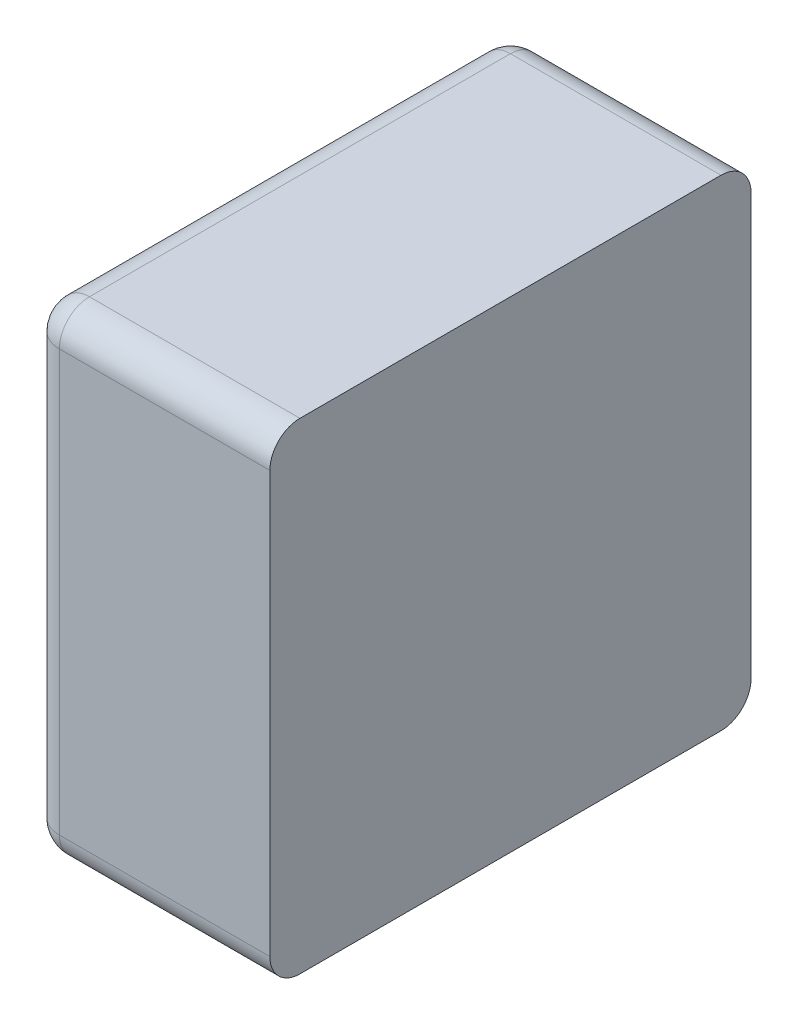
ISO-10303-21;
HEADER;
FILE_DESCRIPTION(('STEP AP214'),'2;1');
FILE_NAME('part.step','',(''),(''),'','','');
FILE_SCHEMA(('AUTOMOTIVE_DESIGN { 1 0 10303 214 1 1 1 1 }'));
ENDSEC;
DATA;
#1=APPLICATION_CONTEXT('core data for automotive mechanical design processes');
#2=APPLICATION_PROTOCOL_DEFINITION('international standard','automotive_design',2000,#1);
#3=PRODUCT_CONTEXT('',#1,'mechanical');
#4=PRODUCT('Part','Part','',(#3));
#5=PRODUCT_RELATED_PRODUCT_CATEGORY('part','',(#4));
#6=PRODUCT_DEFINITION_FORMATION('','',#4);
#7=PRODUCT_DEFINITION_CONTEXT('part definition',#1,'design');
#8=PRODUCT_DEFINITION('design','',#6,#7);
#9=PRODUCT_DEFINITION_SHAPE('','',#8);
#10=(LENGTH_UNIT() NAMED_UNIT(*) SI_UNIT(.MILLI.,.METRE.));
#11=(NAMED_UNIT(*) PLANE_ANGLE_UNIT() SI_UNIT($,.RADIAN.));
#12=(NAMED_UNIT(*) SI_UNIT($,.STERADIAN.) SOLID_ANGLE_UNIT());
#13=UNCERTAINTY_MEASURE_WITH_UNIT(LENGTH_MEASURE(1.E-05),#10,'distance_accuracy_value','');
#14=(GEOMETRIC_REPRESENTATION_CONTEXT(3) GLOBAL_UNCERTAINTY_ASSIGNED_CONTEXT((#13)) GLOBAL_UNIT_ASSIGNED_CONTEXT((#10,
#11,#12)) REPRESENTATION_CONTEXT('',''));
#15=CARTESIAN_POINT('',(0.,0.,0.));
#16=DIRECTION('',(0.,0.,1.));
#17=DIRECTION('',(1.,0.,0.));
#18=AXIS2_PLACEMENT_3D('',#15,#16,#17);
#19=CARTESIAN_POINT('',(0.,0.,0.));
#20=DIRECTION('',(1.,0.,0.));
#21=DIRECTION('',(0.,1.,0.));
#22=AXIS2_PLACEMENT_3D('',#19,#20,#21);
#23=PLANE('',#22);
#24=DIRECTION('',(0.,1.,0.));
#25=VECTOR('',#24,1.);
#26=CARTESIAN_POINT('',(0.,0.,0.75));
#27=LINE('',#26,#25);
#28=CARTESIAN_POINT('',(0.,0.05,0.75));
#29=VERTEX_POINT('',#28);
#30=CARTESIAN_POINT('',(0.,0.75,0.75));
#31=VERTEX_POINT('',#30);
#32=EDGE_CURVE('E11',#29,#31,#27,.T.);
#33=ORIENTED_EDGE('',*,*,#32,.T.);
#34=DIRECTION('',(0.,0.,1.));
#35=VECTOR('',#34,1.);
#36=CARTESIAN_POINT('',(0.,0.75,0.));
#37=LINE('',#36,#35);
#38=CARTESIAN_POINT('',(0.,0.75,0.05));
#39=VERTEX_POINT('',#38);
#40=EDGE_CURVE('E127',#39,#31,#37,.T.);
#41=ORIENTED_EDGE('',*,*,#40,.F.);
#42=DIRECTION('',(0.,1.,0.));
#43=VECTOR('',#42,1.);
#44=CARTESIAN_POINT('',(0.,0.,0.05));
#45=LINE('',#44,#43);
#46=CARTESIAN_POINT('',(0.,0.05,0.05));
#47=VERTEX_POINT('',#46);
#48=EDGE_CURVE('E135',#47,#39,#45,.T.);
#49=ORIENTED_EDGE('',*,*,#48,.F.);
#50=DIRECTION('',(0.,0.,1.));
#51=VECTOR('',#50,1.);
#52=CARTESIAN_POINT('',(0.,0.05,0.));
#53=LINE('',#52,#51);
#54=EDGE_CURVE('E28',#47,#29,#53,.T.);
#55=ORIENTED_EDGE('',*,*,#54,.T.);
#56=EDGE_LOOP('',(#33,#41,#49,#55));
#57=FACE_BOUND('',#56,.T.);
#58=ADVANCED_FACE('F17',(#57),#23,.F.);
#59=CARTESIAN_POINT('',(0.05,0.05,0.));
#60=DIRECTION('',(0.,0.,1.));
#61=DIRECTION('',(-1.,0.,0.));
#62=AXIS2_PLACEMENT_3D('',#59,#60,#61);
#63=CYLINDRICAL_SURFACE('',#62,0.05);
#64=ORIENTED_EDGE('',*,*,#54,.F.);
#65=CARTESIAN_POINT('',(0.05,0.05,0.05));
#66=DIRECTION('',(0.,0.,1.));
#67=DIRECTION('',(-1.,0.,0.));
#68=AXIS2_PLACEMENT_3D('',#65,#66,#67);
#69=CIRCLE('',#68,0.05);
#70=CARTESIAN_POINT('',(0.05,0.,0.05));
#71=VERTEX_POINT('',#70);
#72=EDGE_CURVE('E132',#47,#71,#69,.T.);
#73=ORIENTED_EDGE('',*,*,#72,.T.);
#74=DIRECTION('',(0.,0.,1.));
#75=VECTOR('',#74,1.);
#76=CARTESIAN_POINT('',(0.05,0.,0.));
#77=LINE('',#76,#75);
#78=CARTESIAN_POINT('',(0.05,0.,0.75));
#79=VERTEX_POINT('',#78);
#80=EDGE_CURVE('E191',#71,#79,#77,.T.);
#81=ORIENTED_EDGE('',*,*,#80,.T.);
#82=CARTESIAN_POINT('',(0.05,0.05,0.75));
#83=DIRECTION('',(0.,0.,1.));
#84=DIRECTION('',(-1.,0.,0.));
#85=AXIS2_PLACEMENT_3D('',#82,#83,#84);
#86=CIRCLE('',#85,0.05);
#87=EDGE_CURVE('E128',#29,#79,#86,.T.);
#88=ORIENTED_EDGE('',*,*,#87,.F.);
#89=EDGE_LOOP('',(#64,#73,#81,#88));
#90=FACE_BOUND('',#89,.T.);
#91=ADVANCED_FACE('F261',(#90),#63,.T.);
#92=CARTESIAN_POINT('',(0.05,0.,0.05));
#93=DIRECTION('',(0.,1.,0.));
#94=DIRECTION('',(-1.,0.,0.));
#95=AXIS2_PLACEMENT_3D('',#92,#93,#94);
#96=CYLINDRICAL_SURFACE('',#95,0.05);
#97=ORIENTED_EDGE('',*,*,#48,.T.);
#98=CARTESIAN_POINT('',(0.05,0.75,0.05));
#99=DIRECTION('',(0.,1.,0.));
#100=DIRECTION('',(-1.,0.,0.));
#101=AXIS2_PLACEMENT_3D('',#98,#99,#100);
#102=CIRCLE('',#101,0.05);
#103=CARTESIAN_POINT('',(0.05,0.75,0.));
#104=VERTEX_POINT('',#103);
#105=EDGE_CURVE('E103',#104,#39,#102,.T.);
#106=ORIENTED_EDGE('',*,*,#105,.F.);
#107=DIRECTION('',(0.,1.,0.));
#108=VECTOR('',#107,1.);
#109=CARTESIAN_POINT('',(0.05,0.,0.));
#110=LINE('',#109,#108);
#111=CARTESIAN_POINT('',(0.05,0.05,0.));
#112=VERTEX_POINT('',#111);
#113=EDGE_CURVE('E97',#112,#104,#110,.T.);
#114=ORIENTED_EDGE('',*,*,#113,.F.);
#115=CARTESIAN_POINT('',(0.05,0.05,0.05));
#116=DIRECTION('',(0.,1.,0.));
#117=DIRECTION('',(-1.,0.,0.));
#118=AXIS2_PLACEMENT_3D('',#115,#116,#117);
#119=CIRCLE('',#118,0.05);
#120=EDGE_CURVE('E102',#112,#47,#119,.T.);
#121=ORIENTED_EDGE('',*,*,#120,.T.);
#122=EDGE_LOOP('',(#97,#106,#114,#121));
#123=FACE_BOUND('',#122,.T.);
#124=ADVANCED_FACE('F100',(#123),#96,.T.);
#125=CARTESIAN_POINT('',(0.05,0.,0.75));
#126=DIRECTION('',(0.,1.,0.));
#127=DIRECTION('',(-1.,0.,0.));
#128=AXIS2_PLACEMENT_3D('',#125,#126,#127);
#129=CYLINDRICAL_SURFACE('',#128,0.05);
#130=CARTESIAN_POINT('',(0.05,0.05,0.75));
#131=DIRECTION('',(0.,-1.,0.));
#132=DIRECTION('',(-1.,0.,0.));
#133=AXIS2_PLACEMENT_3D('',#130,#131,#132);
#134=CIRCLE('',#133,0.05);
#135=CARTESIAN_POINT('',(0.05,0.05,0.8));
#136=VERTEX_POINT('',#135);
#137=EDGE_CURVE('E195',#136,#29,#134,.T.);
#138=ORIENTED_EDGE('',*,*,#137,.F.);
#139=DIRECTION('',(0.,1.,0.));
#140=VECTOR('',#139,1.);
#141=CARTESIAN_POINT('',(0.05,0.,0.8));
#142=LINE('',#141,#140);
#143=CARTESIAN_POINT('',(0.05,0.75,0.8));
#144=VERTEX_POINT('',#143);
#145=EDGE_CURVE('E136',#136,#144,#142,.T.);
#146=ORIENTED_EDGE('',*,*,#145,.T.);
#147=CARTESIAN_POINT('',(0.05,0.75,0.75));
#148=DIRECTION('',(0.,1.,0.));
#149=DIRECTION('',(-1.,0.,0.));
#150=AXIS2_PLACEMENT_3D('',#147,#148,#149);
#151=CIRCLE('',#150,0.05);
#152=EDGE_CURVE('E42',#31,#144,#151,.T.);
#153=ORIENTED_EDGE('',*,*,#152,.F.);
#154=ORIENTED_EDGE('',*,*,#32,.F.);
#155=EDGE_LOOP('',(#138,#146,#153,#154));
#156=FACE_BOUND('',#155,.T.);
#157=ADVANCED_FACE('F345',(#156),#129,.T.);
#158=CARTESIAN_POINT('',(0.05,0.75,0.));
#159=DIRECTION('',(0.,0.,1.));
#160=DIRECTION('',(-1.,0.,0.));
#161=AXIS2_PLACEMENT_3D('',#158,#159,#160);
#162=CYLINDRICAL_SURFACE('',#161,0.05);
#163=CARTESIAN_POINT('',(0.05,0.75,0.75));
#164=DIRECTION('',(0.,0.,1.));
#165=DIRECTION('',(-1.,0.,0.));
#166=AXIS2_PLACEMENT_3D('',#163,#164,#165);
#167=CIRCLE('',#166,0.05);
#168=CARTESIAN_POINT('',(0.05,0.8,0.75));
#169=VERTEX_POINT('',#168);
#170=EDGE_CURVE('E157',#169,#31,#167,.T.);
#171=ORIENTED_EDGE('',*,*,#170,.F.);
#172=DIRECTION('',(0.,0.,1.));
#173=VECTOR('',#172,1.);
#174=CARTESIAN_POINT('',(0.05,0.8,0.));
#175=LINE('',#174,#173);
#176=CARTESIAN_POINT('',(0.05,0.8,0.05));
#177=VERTEX_POINT('',#176);
#178=EDGE_CURVE('E150',#177,#169,#175,.T.);
#179=ORIENTED_EDGE('',*,*,#178,.F.);
#180=CARTESIAN_POINT('',(0.05,0.75,0.05));
#181=DIRECTION('',(0.,0.,-1.));
#182=DIRECTION('',(-1.,0.,0.));
#183=AXIS2_PLACEMENT_3D('',#180,#181,#182);
#184=CIRCLE('',#183,0.05);
#185=EDGE_CURVE('E110',#39,#177,#184,.T.);
#186=ORIENTED_EDGE('',*,*,#185,.F.);
#187=ORIENTED_EDGE('',*,*,#40,.T.);
#188=EDGE_LOOP('',(#171,#179,#186,#187));
#189=FACE_BOUND('',#188,.T.);
#190=ADVANCED_FACE('F291',(#189),#162,.T.);
#191=CARTESIAN_POINT('',(0.05,0.05,0.05));
#192=DIRECTION('',(0.,0.,1.));
#193=DIRECTION('',(-1.,0.,0.));
#194=AXIS2_PLACEMENT_3D('',#191,#192,#193);
#195=SPHERICAL_SURFACE('',#194,0.05);
#196=ORIENTED_EDGE('',*,*,#120,.F.);
#197=CARTESIAN_POINT('',(0.05,0.05,0.05));
#198=DIRECTION('',(-1.,0.,0.));
#199=DIRECTION('',(0.,-1.,0.));
#200=AXIS2_PLACEMENT_3D('',#197,#198,#199);
#201=CIRCLE('',#200,0.05);
#202=EDGE_CURVE('E116',#112,#71,#201,.T.);
#203=ORIENTED_EDGE('',*,*,#202,.T.);
#204=ORIENTED_EDGE('',*,*,#72,.F.);
#205=EDGE_LOOP('',(#196,#203,#204));
#206=FACE_BOUND('',#205,.T.);
#207=ADVANCED_FACE('F130',(#206),#195,.T.);
#208=CARTESIAN_POINT('',(0.05,0.05,0.75));
#209=DIRECTION('',(0.,0.,-1.));
#210=DIRECTION('',(-1.,0.,0.));
#211=AXIS2_PLACEMENT_3D('',#208,#209,#210);
#212=SPHERICAL_SURFACE('',#211,0.05);
#213=ORIENTED_EDGE('',*,*,#87,.T.);
#214=CARTESIAN_POINT('',(0.05,0.05,0.75));
#215=DIRECTION('',(1.,0.,0.));
#216=DIRECTION('',(0.,-1.,0.));
#217=AXIS2_PLACEMENT_3D('',#214,#215,#216);
#218=CIRCLE('',#217,0.05);
#219=EDGE_CURVE('E152',#136,#79,#218,.T.);
#220=ORIENTED_EDGE('',*,*,#219,.F.);
#221=ORIENTED_EDGE('',*,*,#137,.T.);
#222=EDGE_LOOP('',(#213,#220,#221));
#223=FACE_BOUND('',#222,.T.);
#224=ADVANCED_FACE('F254',(#223),#212,.T.);
#225=CARTESIAN_POINT('',(0.,0.,0.));
#226=DIRECTION('',(0.,1.,0.));
#227=DIRECTION('',(1.,0.,0.));
#228=AXIS2_PLACEMENT_3D('',#225,#226,#227);
#229=PLANE('',#228);
#230=DIRECTION('',(0.,0.,1.));
#231=VECTOR('',#230,1.);
#232=CARTESIAN_POINT('',(0.4,0.,0.));
#233=LINE('',#232,#231);
#234=CARTESIAN_POINT('',(0.4,0.,0.05));
#235=VERTEX_POINT('',#234);
#236=CARTESIAN_POINT('',(0.4,0.,0.75));
#237=VERTEX_POINT('',#236);
#238=EDGE_CURVE('E199',#235,#237,#233,.T.);
#239=ORIENTED_EDGE('',*,*,#238,.T.);
#240=DIRECTION('',(1.,0.,0.));
#241=VECTOR('',#240,1.);
#242=CARTESIAN_POINT('',(0.,0.,0.75));
#243=LINE('',#242,#241);
#244=EDGE_CURVE('E143',#79,#237,#243,.T.);
#245=ORIENTED_EDGE('',*,*,#244,.F.);
#246=ORIENTED_EDGE('',*,*,#80,.F.);
#247=DIRECTION('',(1.,0.,0.));
#248=VECTOR('',#247,1.);
#249=CARTESIAN_POINT('',(0.,0.,0.05));
#250=LINE('',#249,#248);
#251=EDGE_CURVE('E122',#71,#235,#250,.T.);
#252=ORIENTED_EDGE('',*,*,#251,.T.);
#253=EDGE_LOOP('',(#239,#245,#246,#252));
#254=FACE_BOUND('',#253,.T.);
#255=ADVANCED_FACE('F263',(#254),#229,.F.);
#256=CARTESIAN_POINT('',(0.,0.,0.));
#257=DIRECTION('',(0.,0.,1.));
#258=DIRECTION('',(1.,0.,0.));
#259=AXIS2_PLACEMENT_3D('',#256,#257,#258);
#260=PLANE('',#259);
#261=DIRECTION('',(1.,0.,0.));
#262=VECTOR('',#261,1.);
#263=CARTESIAN_POINT('',(0.,0.75,0.));
#264=LINE('',#263,#262);
#265=CARTESIAN_POINT('',(0.4,0.75,0.));
#266=VERTEX_POINT('',#265);
#267=EDGE_CURVE('E109',#104,#266,#264,.T.);
#268=ORIENTED_EDGE('',*,*,#267,.T.);
#269=DIRECTION('',(0.,1.,0.));
#270=VECTOR('',#269,1.);
#271=CARTESIAN_POINT('',(0.4,0.,0.));
#272=LINE('',#271,#270);
#273=CARTESIAN_POINT('',(0.4,0.05,0.));
#274=VERTEX_POINT('',#273);
#275=EDGE_CURVE('E140',#274,#266,#272,.T.);
#276=ORIENTED_EDGE('',*,*,#275,.F.);
#277=DIRECTION('',(1.,0.,0.));
#278=VECTOR('',#277,1.);
#279=CARTESIAN_POINT('',(0.,0.05,0.));
#280=LINE('',#279,#278);
#281=EDGE_CURVE('E119',#112,#274,#280,.T.);
#282=ORIENTED_EDGE('',*,*,#281,.F.);
#283=ORIENTED_EDGE('',*,*,#113,.T.);
#284=EDGE_LOOP('',(#268,#276,#282,#283));
#285=FACE_BOUND('',#284,.T.);
#286=ADVANCED_FACE('F139',(#285),#260,.F.);
#287=CARTESIAN_POINT('',(0.05,0.75,0.05));
#288=DIRECTION('',(0.,0.,1.));
#289=DIRECTION('',(-1.,0.,0.));
#290=AXIS2_PLACEMENT_3D('',#287,#288,#289);
#291=SPHERICAL_SURFACE('',#290,0.05);
#292=ORIENTED_EDGE('',*,*,#185,.T.);
#293=CARTESIAN_POINT('',(0.05,0.75,0.05));
#294=DIRECTION('',(1.,0.,0.));
#295=DIRECTION('',(0.,1.,0.));
#296=AXIS2_PLACEMENT_3D('',#293,#294,#295);
#297=CIRCLE('',#296,0.05);
#298=EDGE_CURVE('E21',#104,#177,#297,.T.);
#299=ORIENTED_EDGE('',*,*,#298,.F.);
#300=ORIENTED_EDGE('',*,*,#105,.T.);
#301=EDGE_LOOP('',(#292,#299,#300));
#302=FACE_BOUND('',#301,.T.);
#303=ADVANCED_FACE('F295',(#302),#291,.T.);
#304=CARTESIAN_POINT('',(0.,0.,0.8));
#305=DIRECTION('',(0.,0.,1.));
#306=DIRECTION('',(1.,0.,0.));
#307=AXIS2_PLACEMENT_3D('',#304,#305,#306);
#308=PLANE('',#307);
#309=ORIENTED_EDGE('',*,*,#145,.F.);
#310=DIRECTION('',(1.,0.,0.));
#311=VECTOR('',#310,1.);
#312=CARTESIAN_POINT('',(0.,0.05,0.8));
#313=LINE('',#312,#311);
#314=CARTESIAN_POINT('',(0.4,0.05,0.8));
#315=VERTEX_POINT('',#314);
#316=EDGE_CURVE('E169',#136,#315,#313,.T.);
#317=ORIENTED_EDGE('',*,*,#316,.T.);
#318=DIRECTION('',(0.,1.,0.));
#319=VECTOR('',#318,1.);
#320=CARTESIAN_POINT('',(0.4,0.,0.8));
#321=LINE('',#320,#319);
#322=CARTESIAN_POINT('',(0.4,0.75,0.8));
#323=VERTEX_POINT('',#322);
#324=EDGE_CURVE('E156',#315,#323,#321,.T.);
#325=ORIENTED_EDGE('',*,*,#324,.T.);
#326=DIRECTION('',(1.,0.,0.));
#327=VECTOR('',#326,1.);
#328=CARTESIAN_POINT('',(0.,0.75,0.8));
#329=LINE('',#328,#327);
#330=EDGE_CURVE('E219',#144,#323,#329,.T.);
#331=ORIENTED_EDGE('',*,*,#330,.F.);
#332=EDGE_LOOP('',(#309,#317,#325,#331));
#333=FACE_BOUND('',#332,.T.);
#334=ADVANCED_FACE('F318',(#333),#308,.T.);
#335=CARTESIAN_POINT('',(0.05,0.75,0.75));
#336=DIRECTION('',(0.,-1.,0.));
#337=DIRECTION('',(-1.,0.,0.));
#338=AXIS2_PLACEMENT_3D('',#335,#336,#337);
#339=SPHERICAL_SURFACE('',#338,0.05);
#340=ORIENTED_EDGE('',*,*,#152,.T.);
#341=CARTESIAN_POINT('',(0.05,0.75,0.75));
#342=DIRECTION('',(1.,0.,0.));
#343=DIRECTION('',(0.,0.,1.));
#344=AXIS2_PLACEMENT_3D('',#341,#342,#343);
#345=CIRCLE('',#344,0.05);
#346=EDGE_CURVE('E230',#169,#144,#345,.T.);
#347=ORIENTED_EDGE('',*,*,#346,.F.);
#348=ORIENTED_EDGE('',*,*,#170,.T.);
#349=EDGE_LOOP('',(#340,#347,#348));
#350=FACE_BOUND('',#349,.T.);
#351=ADVANCED_FACE('F308',(#350),#339,.T.);
#352=CARTESIAN_POINT('',(0.,0.8,0.));
#353=DIRECTION('',(0.,1.,0.));
#354=DIRECTION('',(1.,0.,0.));
#355=AXIS2_PLACEMENT_3D('',#352,#353,#354);
#356=PLANE('',#355);
#357=DIRECTION('',(1.,0.,0.));
#358=VECTOR('',#357,1.);
#359=CARTESIAN_POINT('',(0.,0.8,0.05));
#360=LINE('',#359,#358);
#361=CARTESIAN_POINT('',(0.4,0.8,0.05));
#362=VERTEX_POINT('',#361);
#363=EDGE_CURVE('E159',#177,#362,#360,.T.);
#364=ORIENTED_EDGE('',*,*,#363,.F.);
#365=ORIENTED_EDGE('',*,*,#178,.T.);
#366=DIRECTION('',(1.,0.,0.));
#367=VECTOR('',#366,1.);
#368=CARTESIAN_POINT('',(0.,0.8,0.75));
#369=LINE('',#368,#367);
#370=CARTESIAN_POINT('',(0.4,0.8,0.75));
#371=VERTEX_POINT('',#370);
#372=EDGE_CURVE('E142',#169,#371,#369,.T.);
#373=ORIENTED_EDGE('',*,*,#372,.T.);
#374=DIRECTION('',(0.,0.,1.));
#375=VECTOR('',#374,1.);
#376=CARTESIAN_POINT('',(0.4,0.8,0.));
#377=LINE('',#376,#375);
#378=EDGE_CURVE('E202',#362,#371,#377,.T.);
#379=ORIENTED_EDGE('',*,*,#378,.F.);
#380=EDGE_LOOP('',(#364,#365,#373,#379));
#381=FACE_BOUND('',#380,.T.);
#382=ADVANCED_FACE('F297',(#381),#356,.T.);
#383=CARTESIAN_POINT('',(0.,0.05,0.05));
#384=DIRECTION('',(1.,0.,0.));
#385=DIRECTION('',(0.,-1.,0.));
#386=AXIS2_PLACEMENT_3D('',#383,#384,#385);
#387=CYLINDRICAL_SURFACE('',#386,0.05);
#388=ORIENTED_EDGE('',*,*,#202,.F.);
#389=ORIENTED_EDGE('',*,*,#281,.T.);
#390=CARTESIAN_POINT('',(0.4,0.05,0.05));
#391=DIRECTION('',(1.,0.,0.));
#392=DIRECTION('',(0.,-1.,0.));
#393=AXIS2_PLACEMENT_3D('',#390,#391,#392);
#394=CIRCLE('',#393,0.05);
#395=EDGE_CURVE('E226',#235,#274,#394,.T.);
#396=ORIENTED_EDGE('',*,*,#395,.F.);
#397=ORIENTED_EDGE('',*,*,#251,.F.);
#398=EDGE_LOOP('',(#388,#389,#396,#397));
#399=FACE_BOUND('',#398,.T.);
#400=ADVANCED_FACE('F117',(#399),#387,.T.);
#401=CARTESIAN_POINT('',(0.,0.05,0.75));
#402=DIRECTION('',(1.,0.,0.));
#403=DIRECTION('',(0.,-1.,0.));
#404=AXIS2_PLACEMENT_3D('',#401,#402,#403);
#405=CYLINDRICAL_SURFACE('',#404,0.05);
#406=ORIENTED_EDGE('',*,*,#244,.T.);
#407=CARTESIAN_POINT('',(0.4,0.05,0.75));
#408=DIRECTION('',(1.,0.,0.));
#409=DIRECTION('',(0.,-1.,0.));
#410=AXIS2_PLACEMENT_3D('',#407,#408,#409);
#411=CIRCLE('',#410,0.05);
#412=EDGE_CURVE('E162',#315,#237,#411,.T.);
#413=ORIENTED_EDGE('',*,*,#412,.F.);
#414=ORIENTED_EDGE('',*,*,#316,.F.);
#415=ORIENTED_EDGE('',*,*,#219,.T.);
#416=EDGE_LOOP('',(#406,#413,#414,#415));
#417=FACE_BOUND('',#416,.T.);
#418=ADVANCED_FACE('F266',(#417),#405,.T.);
#419=CARTESIAN_POINT('',(0.4,0.,0.));
#420=DIRECTION('',(1.,0.,0.));
#421=DIRECTION('',(0.,1.,0.));
#422=AXIS2_PLACEMENT_3D('',#419,#420,#421);
#423=PLANE('',#422);
#424=ORIENTED_EDGE('',*,*,#238,.F.);
#425=ORIENTED_EDGE('',*,*,#395,.T.);
#426=ORIENTED_EDGE('',*,*,#275,.T.);
#427=CARTESIAN_POINT('',(0.4,0.75,0.05));
#428=DIRECTION('',(1.,0.,0.));
#429=DIRECTION('',(0.,1.,0.));
#430=AXIS2_PLACEMENT_3D('',#427,#428,#429);
#431=CIRCLE('',#430,0.05);
#432=EDGE_CURVE('E208',#266,#362,#431,.T.);
#433=ORIENTED_EDGE('',*,*,#432,.T.);
#434=ORIENTED_EDGE('',*,*,#378,.T.);
#435=CARTESIAN_POINT('',(0.4,0.75,0.75));
#436=DIRECTION('',(1.,0.,0.));
#437=DIRECTION('',(0.,1.,0.));
#438=AXIS2_PLACEMENT_3D('',#435,#436,#437);
#439=CIRCLE('',#438,0.05);
#440=EDGE_CURVE('E166',#371,#323,#439,.T.);
#441=ORIENTED_EDGE('',*,*,#440,.T.);
#442=ORIENTED_EDGE('',*,*,#324,.F.);
#443=ORIENTED_EDGE('',*,*,#412,.T.);
#444=EDGE_LOOP('',(#424,#425,#426,#433,#434,#441,#442,#443));
#445=FACE_BOUND('',#444,.T.);
#446=ADVANCED_FACE('F267',(#445),#423,.T.);
#447=CARTESIAN_POINT('',(0.,0.75,0.05));
#448=DIRECTION('',(1.,0.,0.));
#449=DIRECTION('',(0.,1.,0.));
#450=AXIS2_PLACEMENT_3D('',#447,#448,#449);
#451=CYLINDRICAL_SURFACE('',#450,0.05);
#452=ORIENTED_EDGE('',*,*,#363,.T.);
#453=ORIENTED_EDGE('',*,*,#432,.F.);
#454=ORIENTED_EDGE('',*,*,#267,.F.);
#455=ORIENTED_EDGE('',*,*,#298,.T.);
#456=EDGE_LOOP('',(#452,#453,#454,#455));
#457=FACE_BOUND('',#456,.T.);
#458=ADVANCED_FACE('F19',(#457),#451,.T.);
#459=CARTESIAN_POINT('',(0.,0.75,0.75));
#460=DIRECTION('',(1.,0.,0.));
#461=DIRECTION('',(0.,1.,0.));
#462=AXIS2_PLACEMENT_3D('',#459,#460,#461);
#463=CYLINDRICAL_SURFACE('',#462,0.05);
#464=ORIENTED_EDGE('',*,*,#372,.F.);
#465=ORIENTED_EDGE('',*,*,#346,.T.);
#466=ORIENTED_EDGE('',*,*,#330,.T.);
#467=ORIENTED_EDGE('',*,*,#440,.F.);
#468=EDGE_LOOP('',(#464,#465,#466,#467));
#469=FACE_BOUND('',#468,.T.);
#470=ADVANCED_FACE('F391',(#469),#463,.T.);
#471=CLOSED_SHELL('',(#58,#91,#124,#157,#190,#207,#224,#255,#286,#303,#334,#351,#382,#400,#418,
#446,#458,#470));
#472=MANIFOLD_SOLID_BREP('B1',#471);
#473=ADVANCED_BREP_SHAPE_REPRESENTATION('',(#18,#472),#14);
#474=SHAPE_DEFINITION_REPRESENTATION(#9,#473);
ENDSEC;
END-ISO-10303-21;
